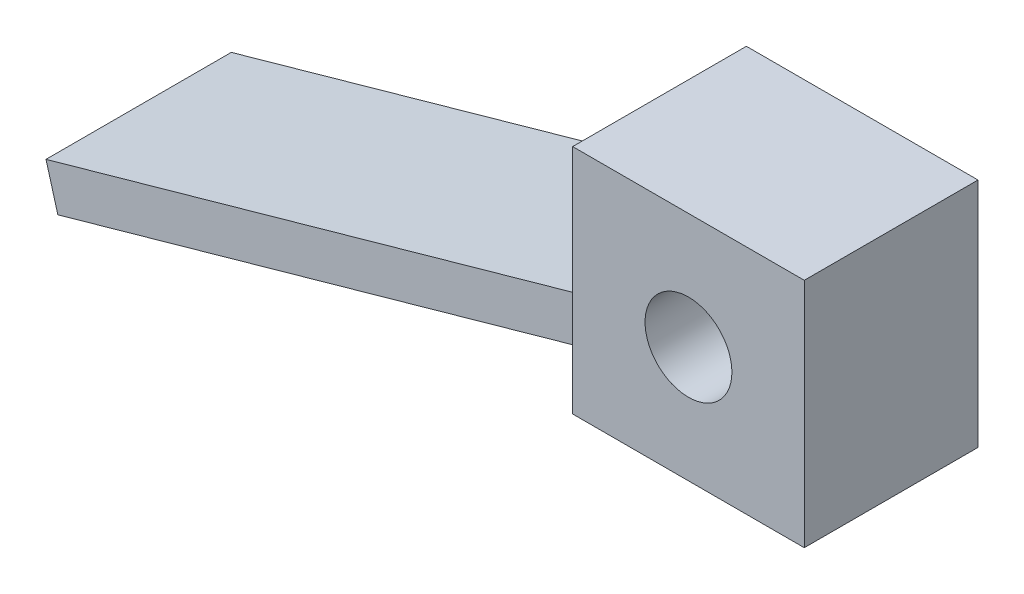
ISO-10303-21;
HEADER;
FILE_DESCRIPTION(('STEP AP214'),'2;1');
FILE_NAME('part.step','',(''),(''),'','','');
FILE_SCHEMA(('AUTOMOTIVE_DESIGN { 1 0 10303 214 1 1 1 1 }'));
ENDSEC;
DATA;
#1=APPLICATION_CONTEXT('core data for automotive mechanical design processes');
#2=APPLICATION_PROTOCOL_DEFINITION('international standard','automotive_design',2000,#1);
#3=PRODUCT_CONTEXT('',#1,'mechanical');
#4=PRODUCT('Part','Part','',(#3));
#5=PRODUCT_RELATED_PRODUCT_CATEGORY('part','',(#4));
#6=PRODUCT_DEFINITION_FORMATION('','',#4);
#7=PRODUCT_DEFINITION_CONTEXT('part definition',#1,'design');
#8=PRODUCT_DEFINITION('design','',#6,#7);
#9=PRODUCT_DEFINITION_SHAPE('','',#8);
#10=(LENGTH_UNIT() NAMED_UNIT(*) SI_UNIT(.MILLI.,.METRE.));
#11=(NAMED_UNIT(*) PLANE_ANGLE_UNIT() SI_UNIT($,.RADIAN.));
#12=(NAMED_UNIT(*) SI_UNIT($,.STERADIAN.) SOLID_ANGLE_UNIT());
#13=UNCERTAINTY_MEASURE_WITH_UNIT(LENGTH_MEASURE(1.E-05),#10,'distance_accuracy_value','');
#14=(GEOMETRIC_REPRESENTATION_CONTEXT(3) GLOBAL_UNCERTAINTY_ASSIGNED_CONTEXT((#13)) GLOBAL_UNIT_ASSIGNED_CONTEXT((#10,
#11,#12)) REPRESENTATION_CONTEXT('',''));
#15=CARTESIAN_POINT('',(0.,0.,0.));
#16=DIRECTION('',(0.,0.,1.));
#17=DIRECTION('',(1.,0.,0.));
#18=AXIS2_PLACEMENT_3D('',#15,#16,#17);
#19=CARTESIAN_POINT('',(1.49506346967559,0.,-30.));
#20=DIRECTION('',(-0.734009121233507,0.679139610055263,0.));
#21=DIRECTION('',(-0.679139610055263,-0.734009121233507,0.));
#22=AXIS2_PLACEMENT_3D('',#19,#20,#21);
#23=PLANE('',#22);
#24=DIRECTION('',(0.,0.,1.));
#25=VECTOR('',#24,1.);
#26=CARTESIAN_POINT('',(-0.374188301657877,-2.02027363700522,-30.));
#27=LINE('',#26,#25);
#28=CARTESIAN_POINT('',(-0.374188301657877,-2.02027363700522,-30.));
#29=VERTEX_POINT('',#28);
#30=CARTESIAN_POINT('',(-0.374188301657877,-2.02027363700522,1.99999999999998));
#31=VERTEX_POINT('',#30);
#32=EDGE_CURVE('E186',#29,#31,#27,.T.);
#33=ORIENTED_EDGE('',*,*,#32,.T.);
#34=DIRECTION('',(-0.679139610055263,-0.734009121233507,0.));
#35=VECTOR('',#34,1.);
#36=CARTESIAN_POINT('',(1.49506346967559,0.,2.));
#37=LINE('',#36,#35);
#38=CARTESIAN_POINT('',(1.49506346967559,0.,2.));
#39=VERTEX_POINT('',#38);
#40=EDGE_CURVE('E63',#39,#31,#37,.T.);
#41=ORIENTED_EDGE('',*,*,#40,.F.);
#42=DIRECTION('',(0.,0.,1.));
#43=VECTOR('',#42,1.);
#44=CARTESIAN_POINT('',(1.49506346967559,0.,-30.));
#45=LINE('',#44,#43);
#46=CARTESIAN_POINT('',(1.49506346967559,0.,0.));
#47=VERTEX_POINT('',#46);
#48=EDGE_CURVE('E54',#47,#39,#45,.T.);
#49=ORIENTED_EDGE('',*,*,#48,.F.);
#50=CARTESIAN_POINT('',(1.49506346967559,0.,-30.));
#51=VERTEX_POINT('',#50);
#52=EDGE_CURVE('E187',#51,#47,#45,.T.);
#53=ORIENTED_EDGE('',*,*,#52,.F.);
#54=DIRECTION('',(-0.679139610055263,-0.734009121233507,0.));
#55=VECTOR('',#54,1.);
#56=CARTESIAN_POINT('',(1.49506346967559,0.,-30.));
#57=LINE('',#56,#55);
#58=EDGE_CURVE('E173',#51,#29,#57,.T.);
#59=ORIENTED_EDGE('',*,*,#58,.T.);
#60=EDGE_LOOP('',(#33,#41,#49,#53,#59));
#61=FACE_BOUND('',#60,.T.);
#62=ADVANCED_FACE('F45',(#61),#23,.T.);
#63=CARTESIAN_POINT('',(9.49506346967559,0.,-30.));
#64=DIRECTION('',(0.707106781186554,-0.707106781186541,0.));
#65=DIRECTION('',(0.707106781186541,0.707106781186554,0.));
#66=AXIS2_PLACEMENT_3D('',#63,#64,#65);
#67=PLANE('',#66);
#68=DIRECTION('',(0.,0.,1.));
#69=VECTOR('',#68,1.);
#70=CARTESIAN_POINT('',(9.49506346967559,0.,-30.));
#71=LINE('',#70,#69);
#72=CARTESIAN_POINT('',(9.49506346967559,0.,0.));
#73=VERTEX_POINT('',#72);
#74=CARTESIAN_POINT('',(9.49506346967559,0.,2.));
#75=VERTEX_POINT('',#74);
#76=EDGE_CURVE('E11',#73,#75,#71,.T.);
#77=ORIENTED_EDGE('',*,*,#76,.T.);
#78=DIRECTION('',(0.707106781186541,0.707106781186554,0.));
#79=VECTOR('',#78,1.);
#80=CARTESIAN_POINT('',(-0.374188301657877,-9.86925177133364,2.));
#81=LINE('',#80,#79);
#82=CARTESIAN_POINT('',(-0.374188301657877,-9.86925177133364,2.));
#83=VERTEX_POINT('',#82);
#84=EDGE_CURVE('E167',#83,#75,#81,.T.);
#85=ORIENTED_EDGE('',*,*,#84,.F.);
#86=DIRECTION('',(0.,0.,1.));
#87=VECTOR('',#86,1.);
#88=CARTESIAN_POINT('',(-0.374188301657877,-9.86925177133364,-30.));
#89=LINE('',#88,#87);
#90=CARTESIAN_POINT('',(-0.374188301657877,-9.86925177133364,-30.));
#91=VERTEX_POINT('',#90);
#92=EDGE_CURVE('E192',#91,#83,#89,.T.);
#93=ORIENTED_EDGE('',*,*,#92,.F.);
#94=DIRECTION('',(0.707106781186541,0.707106781186554,0.));
#95=VECTOR('',#94,1.);
#96=CARTESIAN_POINT('',(9.49506346967559,0.,-30.));
#97=LINE('',#96,#95);
#98=CARTESIAN_POINT('',(9.49506346967559,0.,-30.));
#99=VERTEX_POINT('',#98);
#100=EDGE_CURVE('E180',#91,#99,#97,.T.);
#101=ORIENTED_EDGE('',*,*,#100,.T.);
#102=EDGE_CURVE('E56',#99,#73,#71,.T.);
#103=ORIENTED_EDGE('',*,*,#102,.T.);
#104=EDGE_LOOP('',(#77,#85,#93,#101,#103));
#105=FACE_BOUND('',#104,.T.);
#106=ADVANCED_FACE('F242',(#105),#67,.T.);
#107=CARTESIAN_POINT('',(-0.374188301657877,-9.86925177133364,-30.));
#108=DIRECTION('',(0.270872570158997,-0.962615214265523,0.));
#109=DIRECTION('',(0.962615214265523,0.270872570158997,0.));
#110=AXIS2_PLACEMENT_3D('',#107,#108,#109);
#111=PLANE('',#110);
#112=ORIENTED_EDGE('',*,*,#92,.T.);
#113=DIRECTION('',(0.962615214265523,0.270872570158996,0.));
#114=VECTOR('',#113,1.);
#115=CARTESIAN_POINT('',(-68.7776756077517,-29.1174707272093,2.));
#116=LINE('',#115,#114);
#117=CARTESIAN_POINT('',(-116.908436321028,-42.6610992351591,1.99999999999999));
#118=VERTEX_POINT('',#117);
#119=EDGE_CURVE('E147',#118,#83,#116,.T.);
#120=ORIENTED_EDGE('',*,*,#119,.F.);
#121=DIRECTION('',(0.,0.,-1.));
#122=VECTOR('',#121,1.);
#123=CARTESIAN_POINT('',(-116.908436321028,-42.6610992351591,1.99999999999999));
#124=LINE('',#123,#122);
#125=CARTESIAN_POINT('',(-116.908436321028,-42.6610992351591,-30.));
#126=VERTEX_POINT('',#125);
#127=EDGE_CURVE('E156',#118,#126,#124,.T.);
#128=ORIENTED_EDGE('',*,*,#127,.T.);
#129=DIRECTION('',(0.962615214265523,0.270872570158996,0.));
#130=VECTOR('',#129,1.);
#131=CARTESIAN_POINT('',(-0.374188301657877,-9.86925177133364,-30.));
#132=LINE('',#131,#130);
#133=EDGE_CURVE('E177',#126,#91,#132,.T.);
#134=ORIENTED_EDGE('',*,*,#133,.T.);
#135=EDGE_LOOP('',(#112,#120,#128,#134));
#136=FACE_BOUND('',#135,.T.);
#137=ADVANCED_FACE('F247',(#136),#111,.T.);
#138=CARTESIAN_POINT('',(-0.374188301657877,-2.02027363700522,-30.));
#139=DIRECTION('',(-0.270872570158997,0.962615214265523,0.));
#140=DIRECTION('',(-0.962615214265524,-0.270872570158997,0.));
#141=AXIS2_PLACEMENT_3D('',#138,#139,#140);
#142=PLANE('',#141);
#143=DIRECTION('',(-0.962615214265523,-0.270872570158997,0.));
#144=VECTOR('',#143,1.);
#145=CARTESIAN_POINT('',(-0.374188301657877,-2.02027363700522,-30.));
#146=LINE('',#145,#144);
#147=CARTESIAN_POINT('',(-118.955026422307,-35.3880159262811,-30.));
#148=VERTEX_POINT('',#147);
#149=EDGE_CURVE('E160',#29,#148,#146,.T.);
#150=ORIENTED_EDGE('',*,*,#149,.T.);
#151=DIRECTION('',(0.,0.,-1.));
#152=VECTOR('',#151,1.);
#153=CARTESIAN_POINT('',(-118.955026422307,-35.3880159262811,1.99999999999999));
#154=LINE('',#153,#152);
#155=CARTESIAN_POINT('',(-118.955026422307,-35.3880159262811,1.99999999999999));
#156=VERTEX_POINT('',#155);
#157=EDGE_CURVE('E154',#156,#148,#154,.T.);
#158=ORIENTED_EDGE('',*,*,#157,.F.);
#159=DIRECTION('',(-0.962615214265523,-0.270872570158997,0.));
#160=VECTOR('',#159,1.);
#161=CARTESIAN_POINT('',(-0.374188301657877,-2.02027363700522,2.));
#162=LINE('',#161,#160);
#163=EDGE_CURVE('E139',#31,#156,#162,.T.);
#164=ORIENTED_EDGE('',*,*,#163,.F.);
#165=ORIENTED_EDGE('',*,*,#32,.F.);
#166=EDGE_LOOP('',(#150,#158,#164,#165));
#167=FACE_BOUND('',#166,.T.);
#168=ADVANCED_FACE('F158',(#167),#142,.T.);
#169=CARTESIAN_POINT('',(0.,40.,30.));
#170=DIRECTION('',(1.,0.,0.));
#171=DIRECTION('',(0.,0.,-1.));
#172=AXIS2_PLACEMENT_3D('',#169,#170,#171);
#173=PLANE('',#172);
#174=DIRECTION('',(0.,-1.,0.));
#175=VECTOR('',#174,1.);
#176=CARTESIAN_POINT('',(0.,40.,0.));
#177=LINE('',#176,#175);
#178=CARTESIAN_POINT('',(0.,40.,0.));
#179=VERTEX_POINT('',#178);
#180=CARTESIAN_POINT('',(0.,0.,0.));
#181=VERTEX_POINT('',#180);
#182=EDGE_CURVE('E199',#179,#181,#177,.T.);
#183=ORIENTED_EDGE('',*,*,#182,.T.);
#184=DIRECTION('',(0.,0.,-1.));
#185=VECTOR('',#184,1.);
#186=CARTESIAN_POINT('',(0.,0.,30.));
#187=LINE('',#186,#185);
#188=CARTESIAN_POINT('',(0.,0.,30.));
#189=VERTEX_POINT('',#188);
#190=EDGE_CURVE('E49',#189,#181,#187,.T.);
#191=ORIENTED_EDGE('',*,*,#190,.F.);
#192=DIRECTION('',(0.,-1.,0.));
#193=VECTOR('',#192,1.);
#194=CARTESIAN_POINT('',(0.,40.,30.));
#195=LINE('',#194,#193);
#196=CARTESIAN_POINT('',(0.,40.,30.));
#197=VERTEX_POINT('',#196);
#198=EDGE_CURVE('E202',#197,#189,#195,.T.);
#199=ORIENTED_EDGE('',*,*,#198,.F.);
#200=DIRECTION('',(0.,0.,-1.));
#201=VECTOR('',#200,1.);
#202=CARTESIAN_POINT('',(0.,40.,30.));
#203=LINE('',#202,#201);
#204=EDGE_CURVE('E208',#197,#179,#203,.T.);
#205=ORIENTED_EDGE('',*,*,#204,.T.);
#206=EDGE_LOOP('',(#183,#191,#199,#205));
#207=FACE_BOUND('',#206,.T.);
#208=ADVANCED_FACE('F47',(#207),#173,.F.);
#209=CARTESIAN_POINT('',(0.,0.,30.));
#210=DIRECTION('',(0.,1.,0.));
#211=DIRECTION('',(0.,0.,1.));
#212=AXIS2_PLACEMENT_3D('',#209,#210,#211);
#213=PLANE('',#212);
#214=DIRECTION('',(1.,0.,0.));
#215=VECTOR('',#214,1.);
#216=CARTESIAN_POINT('',(0.,0.,0.));
#217=LINE('',#216,#215);
#218=EDGE_CURVE('E212',#181,#47,#217,.T.);
#219=ORIENTED_EDGE('',*,*,#218,.T.);
#220=ORIENTED_EDGE('',*,*,#48,.T.);
#221=DIRECTION('',(-1.,0.,0.));
#222=VECTOR('',#221,1.);
#223=CARTESIAN_POINT('',(9.49506346967559,0.,2.));
#224=LINE('',#223,#222);
#225=EDGE_CURVE('E170',#75,#39,#224,.T.);
#226=ORIENTED_EDGE('',*,*,#225,.F.);
#227=ORIENTED_EDGE('',*,*,#76,.F.);
#228=CARTESIAN_POINT('',(40.,0.,0.));
#229=VERTEX_POINT('',#228);
#230=EDGE_CURVE('E211',#73,#229,#217,.T.);
#231=ORIENTED_EDGE('',*,*,#230,.T.);
#232=DIRECTION('',(0.,0.,-1.));
#233=VECTOR('',#232,1.);
#234=CARTESIAN_POINT('',(40.,0.,30.));
#235=LINE('',#234,#233);
#236=CARTESIAN_POINT('',(40.,0.,30.));
#237=VERTEX_POINT('',#236);
#238=EDGE_CURVE('E221',#237,#229,#235,.T.);
#239=ORIENTED_EDGE('',*,*,#238,.F.);
#240=DIRECTION('',(1.,0.,0.));
#241=VECTOR('',#240,1.);
#242=CARTESIAN_POINT('',(0.,0.,30.));
#243=LINE('',#242,#241);
#244=EDGE_CURVE('E101',#189,#237,#243,.T.);
#245=ORIENTED_EDGE('',*,*,#244,.F.);
#246=ORIENTED_EDGE('',*,*,#190,.T.);
#247=EDGE_LOOP('',(#219,#220,#226,#227,#231,#239,#245,#246));
#248=FACE_BOUND('',#247,.T.);
#249=ADVANCED_FACE('F228',(#248),#213,.F.);
#250=CARTESIAN_POINT('',(40.,0.,30.));
#251=DIRECTION('',(-1.,0.,0.));
#252=DIRECTION('',(0.,0.,1.));
#253=AXIS2_PLACEMENT_3D('',#250,#251,#252);
#254=PLANE('',#253);
#255=DIRECTION('',(0.,1.,0.));
#256=VECTOR('',#255,1.);
#257=CARTESIAN_POINT('',(40.,0.,0.));
#258=LINE('',#257,#256);
#259=CARTESIAN_POINT('',(40.,40.,0.));
#260=VERTEX_POINT('',#259);
#261=EDGE_CURVE('E215',#229,#260,#258,.T.);
#262=ORIENTED_EDGE('',*,*,#261,.T.);
#263=DIRECTION('',(0.,0.,-1.));
#264=VECTOR('',#263,1.);
#265=CARTESIAN_POINT('',(40.,40.,30.));
#266=LINE('',#265,#264);
#267=CARTESIAN_POINT('',(40.,40.,30.));
#268=VERTEX_POINT('',#267);
#269=EDGE_CURVE('E220',#268,#260,#266,.T.);
#270=ORIENTED_EDGE('',*,*,#269,.F.);
#271=DIRECTION('',(0.,1.,0.));
#272=VECTOR('',#271,1.);
#273=CARTESIAN_POINT('',(40.,0.,30.));
#274=LINE('',#273,#272);
#275=EDGE_CURVE('E205',#237,#268,#274,.T.);
#276=ORIENTED_EDGE('',*,*,#275,.F.);
#277=ORIENTED_EDGE('',*,*,#238,.T.);
#278=EDGE_LOOP('',(#262,#270,#276,#277));
#279=FACE_BOUND('',#278,.T.);
#280=ADVANCED_FACE('F275',(#279),#254,.F.);
#281=CARTESIAN_POINT('',(40.,40.,30.));
#282=DIRECTION('',(0.,-1.,0.));
#283=DIRECTION('',(0.,0.,-1.));
#284=AXIS2_PLACEMENT_3D('',#281,#282,#283);
#285=PLANE('',#284);
#286=DIRECTION('',(-1.,0.,0.));
#287=VECTOR('',#286,1.);
#288=CARTESIAN_POINT('',(40.,40.,0.));
#289=LINE('',#288,#287);
#290=EDGE_CURVE('E93',#260,#179,#289,.T.);
#291=ORIENTED_EDGE('',*,*,#290,.T.);
#292=ORIENTED_EDGE('',*,*,#204,.F.);
#293=DIRECTION('',(-1.,0.,0.));
#294=VECTOR('',#293,1.);
#295=CARTESIAN_POINT('',(40.,40.,30.));
#296=LINE('',#295,#294);
#297=EDGE_CURVE('E72',#268,#197,#296,.T.);
#298=ORIENTED_EDGE('',*,*,#297,.F.);
#299=ORIENTED_EDGE('',*,*,#269,.T.);
#300=EDGE_LOOP('',(#291,#292,#298,#299));
#301=FACE_BOUND('',#300,.T.);
#302=ADVANCED_FACE('F269',(#301),#285,.F.);
#303=CARTESIAN_POINT('',(0.,0.,30.));
#304=DIRECTION('',(0.,0.,1.));
#305=DIRECTION('',(1.,0.,0.));
#306=AXIS2_PLACEMENT_3D('',#303,#304,#305);
#307=PLANE('',#306);
#308=ORIENTED_EDGE('',*,*,#244,.T.);
#309=ORIENTED_EDGE('',*,*,#275,.T.);
#310=ORIENTED_EDGE('',*,*,#297,.T.);
#311=ORIENTED_EDGE('',*,*,#198,.T.);
#312=EDGE_LOOP('',(#308,#309,#310,#311));
#313=FACE_BOUND('',#312,.T.);
#314=CARTESIAN_POINT('',(20.,20.,30.));
#315=DIRECTION('',(0.,0.,1.));
#316=DIRECTION('',(1.,0.,0.));
#317=AXIS2_PLACEMENT_3D('',#314,#315,#316);
#318=CIRCLE('',#317,7.5);
#319=CARTESIAN_POINT('',(27.5,20.,30.));
#320=VERTEX_POINT('',#319);
#321=EDGE_CURVE('E189',#320,#320,#318,.T.);
#322=ORIENTED_EDGE('',*,*,#321,.F.);
#323=EDGE_LOOP('',(#322));
#324=FACE_BOUND('',#323,.T.);
#325=ADVANCED_FACE('F267',(#313,#324),#307,.T.);
#326=CARTESIAN_POINT('',(0.,0.,0.));
#327=DIRECTION('',(0.,0.,1.));
#328=DIRECTION('',(1.,0.,0.));
#329=AXIS2_PLACEMENT_3D('',#326,#327,#328);
#330=PLANE('',#329);
#331=CARTESIAN_POINT('',(20.,20.,0.));
#332=DIRECTION('',(0.,0.,1.));
#333=DIRECTION('',(1.,0.,0.));
#334=AXIS2_PLACEMENT_3D('',#331,#332,#333);
#335=CIRCLE('',#334,7.5);
#336=CARTESIAN_POINT('',(27.5,20.,0.));
#337=VERTEX_POINT('',#336);
#338=EDGE_CURVE('E196',#337,#337,#335,.T.);
#339=ORIENTED_EDGE('',*,*,#338,.T.);
#340=EDGE_LOOP('',(#339));
#341=FACE_BOUND('',#340,.T.);
#342=ORIENTED_EDGE('',*,*,#182,.F.);
#343=ORIENTED_EDGE('',*,*,#290,.F.);
#344=ORIENTED_EDGE('',*,*,#261,.F.);
#345=ORIENTED_EDGE('',*,*,#230,.F.);
#346=EDGE_CURVE('E216',#47,#73,#217,.T.);
#347=ORIENTED_EDGE('',*,*,#346,.F.);
#348=ORIENTED_EDGE('',*,*,#218,.F.);
#349=EDGE_LOOP('',(#342,#343,#344,#345,#347,#348));
#350=FACE_BOUND('',#349,.T.);
#351=ADVANCED_FACE('F239',(#341,#350),#330,.F.);
#352=CARTESIAN_POINT('',(20.,20.,0.));
#353=DIRECTION('',(0.,0.,1.));
#354=DIRECTION('',(1.,0.,0.));
#355=AXIS2_PLACEMENT_3D('',#352,#353,#354);
#356=CYLINDRICAL_SURFACE('',#355,7.5);
#357=ORIENTED_EDGE('',*,*,#338,.F.);
#358=EDGE_LOOP('',(#357));
#359=FACE_BOUND('',#358,.T.);
#360=ORIENTED_EDGE('',*,*,#321,.T.);
#361=EDGE_LOOP('',(#360));
#362=FACE_BOUND('',#361,.T.);
#363=ADVANCED_FACE('F263',(#359,#362),#356,.F.);
#364=CARTESIAN_POINT('',(1.49506346967559,0.,-30.));
#365=DIRECTION('',(0.,1.,0.));
#366=DIRECTION('',(0.,0.,1.));
#367=AXIS2_PLACEMENT_3D('',#364,#365,#366);
#368=PLANE('',#367);
#369=ORIENTED_EDGE('',*,*,#52,.T.);
#370=ORIENTED_EDGE('',*,*,#346,.T.);
#371=ORIENTED_EDGE('',*,*,#102,.F.);
#372=DIRECTION('',(-1.,0.,0.));
#373=VECTOR('',#372,1.);
#374=CARTESIAN_POINT('',(1.49506346967559,0.,-30.));
#375=LINE('',#374,#373);
#376=EDGE_CURVE('E183',#99,#51,#375,.T.);
#377=ORIENTED_EDGE('',*,*,#376,.T.);
#378=EDGE_LOOP('',(#369,#370,#371,#377));
#379=FACE_BOUND('',#378,.T.);
#380=ADVANCED_FACE('F234',(#379),#368,.T.);
#381=CARTESIAN_POINT('',(0.,0.,-30.));
#382=DIRECTION('',(0.,0.,-1.));
#383=DIRECTION('',(-1.,0.,0.));
#384=AXIS2_PLACEMENT_3D('',#381,#382,#383);
#385=PLANE('',#384);
#386=ORIENTED_EDGE('',*,*,#58,.F.);
#387=ORIENTED_EDGE('',*,*,#376,.F.);
#388=ORIENTED_EDGE('',*,*,#100,.F.);
#389=ORIENTED_EDGE('',*,*,#133,.F.);
#390=DIRECTION('',(0.270872570158997,-0.962615214265523,0.));
#391=VECTOR('',#390,1.);
#392=CARTESIAN_POINT('',(-118.955026422307,-35.3880159262811,-30.));
#393=LINE('',#392,#391);
#394=EDGE_CURVE('E148',#148,#126,#393,.T.);
#395=ORIENTED_EDGE('',*,*,#394,.F.);
#396=ORIENTED_EDGE('',*,*,#149,.F.);
#397=EDGE_LOOP('',(#386,#387,#388,#389,#395,#396));
#398=FACE_BOUND('',#397,.T.);
#399=ADVANCED_FACE('F245',(#398),#385,.T.);
#400=CARTESIAN_POINT('',(0.,0.,2.));
#401=DIRECTION('',(0.,0.,1.));
#402=DIRECTION('',(1.,0.,0.));
#403=AXIS2_PLACEMENT_3D('',#400,#401,#402);
#404=PLANE('',#403);
#405=ORIENTED_EDGE('',*,*,#163,.T.);
#406=DIRECTION('',(0.270872570158997,-0.962615214265523,0.));
#407=VECTOR('',#406,1.);
#408=CARTESIAN_POINT('',(-118.955026422307,-35.3880159262811,1.99999999999999));
#409=LINE('',#408,#407);
#410=EDGE_CURVE('E142',#156,#118,#409,.T.);
#411=ORIENTED_EDGE('',*,*,#410,.T.);
#412=ORIENTED_EDGE('',*,*,#119,.T.);
#413=ORIENTED_EDGE('',*,*,#84,.T.);
#414=ORIENTED_EDGE('',*,*,#225,.T.);
#415=ORIENTED_EDGE('',*,*,#40,.T.);
#416=EDGE_LOOP('',(#405,#411,#412,#413,#414,#415));
#417=FACE_BOUND('',#416,.T.);
#418=ADVANCED_FACE('F141',(#417),#404,.T.);
#419=CARTESIAN_POINT('',(-118.955026422307,-35.3880159262811,1.99999999999999));
#420=DIRECTION('',(-0.962615214265523,-0.270872570158997,0.));
#421=DIRECTION('',(0.270872570158997,-0.962615214265523,0.));
#422=AXIS2_PLACEMENT_3D('',#419,#420,#421);
#423=PLANE('',#422);
#424=ORIENTED_EDGE('',*,*,#127,.F.);
#425=ORIENTED_EDGE('',*,*,#410,.F.);
#426=ORIENTED_EDGE('',*,*,#157,.T.);
#427=ORIENTED_EDGE('',*,*,#394,.T.);
#428=EDGE_LOOP('',(#424,#425,#426,#427));
#429=FACE_BOUND('',#428,.T.);
#430=ADVANCED_FACE('F152',(#429),#423,.T.);
#431=CLOSED_SHELL('',(#62,#106,#137,#168,#208,#249,#280,#302,#325,#351,#363,#380,#399,#418,#430));
#432=MANIFOLD_SOLID_BREP('B2',#431);
#433=ADVANCED_BREP_SHAPE_REPRESENTATION('',(#18,#432),#14);
#434=SHAPE_DEFINITION_REPRESENTATION(#9,#433);
ENDSEC;
END-ISO-10303-21;
